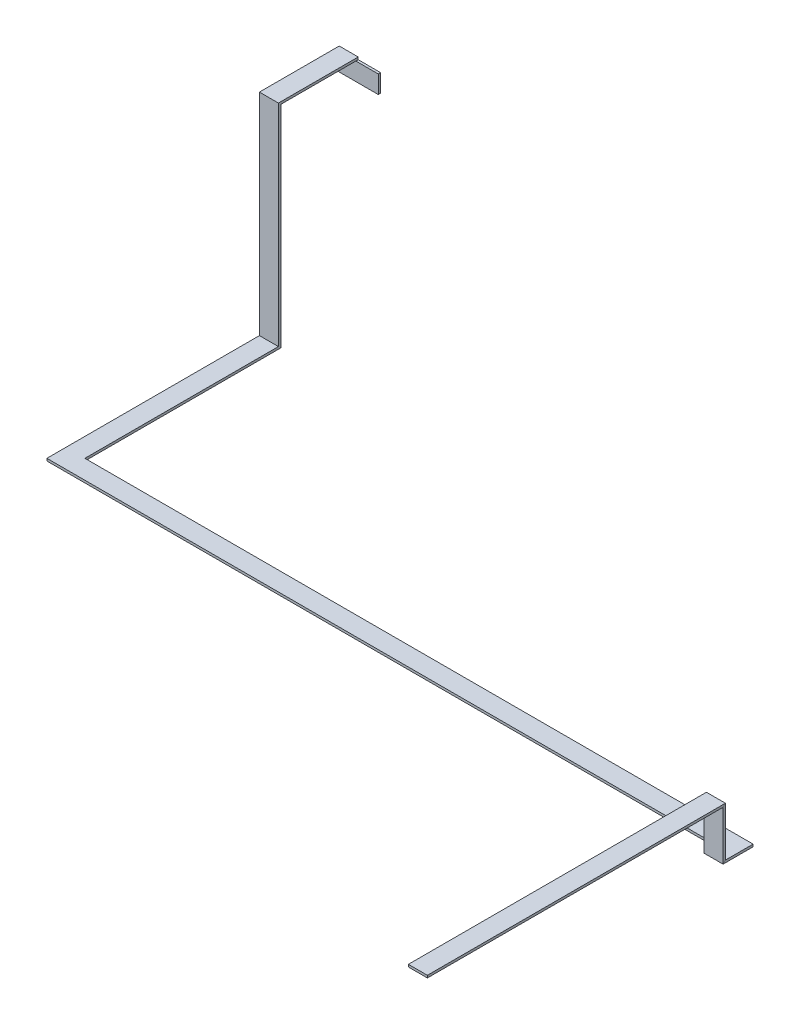
ISO-10303-21;
HEADER;
FILE_DESCRIPTION(('STEP AP214'),'2;1');
FILE_NAME('part.step','',(''),(''),'','','');
FILE_SCHEMA(('AUTOMOTIVE_DESIGN { 1 0 10303 214 1 1 1 1 }'));
ENDSEC;
DATA;
#1=APPLICATION_CONTEXT('core data for automotive mechanical design processes');
#2=APPLICATION_PROTOCOL_DEFINITION('international standard','automotive_design',2000,#1);
#3=PRODUCT_CONTEXT('',#1,'mechanical');
#4=PRODUCT('Part','Part','',(#3));
#5=PRODUCT_RELATED_PRODUCT_CATEGORY('part','',(#4));
#6=PRODUCT_DEFINITION_FORMATION('','',#4);
#7=PRODUCT_DEFINITION_CONTEXT('part definition',#1,'design');
#8=PRODUCT_DEFINITION('design','',#6,#7);
#9=PRODUCT_DEFINITION_SHAPE('','',#8);
#10=(LENGTH_UNIT() NAMED_UNIT(*) SI_UNIT(.MILLI.,.METRE.));
#11=(NAMED_UNIT(*) PLANE_ANGLE_UNIT() SI_UNIT($,.RADIAN.));
#12=(NAMED_UNIT(*) SI_UNIT($,.STERADIAN.) SOLID_ANGLE_UNIT());
#13=UNCERTAINTY_MEASURE_WITH_UNIT(LENGTH_MEASURE(1.E-05),#10,'distance_accuracy_value','');
#14=(GEOMETRIC_REPRESENTATION_CONTEXT(3) GLOBAL_UNCERTAINTY_ASSIGNED_CONTEXT((#13)) GLOBAL_UNIT_ASSIGNED_CONTEXT((#10,
#11,#12)) REPRESENTATION_CONTEXT('',''));
#15=CARTESIAN_POINT('',(0.,0.,0.));
#16=DIRECTION('',(0.,0.,1.));
#17=DIRECTION('',(1.,0.,0.));
#18=AXIS2_PLACEMENT_3D('',#15,#16,#17);
#19=CARTESIAN_POINT('',(0.,0.,0.));
#20=DIRECTION('',(0.,0.,1.));
#21=DIRECTION('',(1.,0.,0.));
#22=AXIS2_PLACEMENT_3D('',#19,#20,#21);
#23=PLANE('',#22);
#24=DIRECTION('',(-1.,0.,0.));
#25=VECTOR('',#24,1.);
#26=CARTESIAN_POINT('',(25.4,278.885,0.));
#27=LINE('',#26,#25);
#28=CARTESIAN_POINT('',(25.4,278.885,0.));
#29=VERTEX_POINT('',#28);
#30=CARTESIAN_POINT('',(-25.4,278.885,0.));
#31=VERTEX_POINT('',#30);
#32=EDGE_CURVE('E273',#29,#31,#27,.T.);
#33=ORIENTED_EDGE('',*,*,#32,.F.);
#34=DIRECTION('',(0.,1.,0.));
#35=VECTOR('',#34,1.);
#36=CARTESIAN_POINT('',(25.4,285.195,0.));
#37=LINE('',#36,#35);
#38=CARTESIAN_POINT('',(25.4,-285.195,0.));
#39=VERTEX_POINT('',#38);
#40=EDGE_CURVE('E316',#39,#29,#37,.T.);
#41=ORIENTED_EDGE('',*,*,#40,.F.);
#42=DIRECTION('',(1.,0.,0.));
#43=VECTOR('',#42,1.);
#44=CARTESIAN_POINT('',(-25.4,-285.195,0.));
#45=LINE('',#44,#43);
#46=CARTESIAN_POINT('',(-25.4,-285.195,0.));
#47=VERTEX_POINT('',#46);
#48=EDGE_CURVE('E320',#47,#39,#45,.T.);
#49=ORIENTED_EDGE('',*,*,#48,.F.);
#50=DIRECTION('',(0.,-1.,0.));
#51=VECTOR('',#50,1.);
#52=CARTESIAN_POINT('',(-25.4,285.195,0.));
#53=LINE('',#52,#51);
#54=EDGE_CURVE('E327',#31,#47,#53,.T.);
#55=ORIENTED_EDGE('',*,*,#54,.F.);
#56=EDGE_LOOP('',(#33,#41,#49,#55));
#57=FACE_BOUND('',#56,.T.);
#58=ADVANCED_FACE('F37',(#57),#23,.F.);
#59=CARTESIAN_POINT('',(25.4,285.195,6.31));
#60=DIRECTION('',(-1.,0.,0.));
#61=DIRECTION('',(0.,-1.,0.));
#62=AXIS2_PLACEMENT_3D('',#59,#60,#61);
#63=PLANE('',#62);
#64=DIRECTION('',(0.,0.,-1.));
#65=VECTOR('',#64,1.);
#66=CARTESIAN_POINT('',(25.4,278.885,0.));
#67=LINE('',#66,#65);
#68=CARTESIAN_POINT('',(25.4,278.885,-200.845));
#69=VERTEX_POINT('',#68);
#70=EDGE_CURVE('E272',#29,#69,#67,.T.);
#71=ORIENTED_EDGE('',*,*,#70,.T.);
#72=DIRECTION('',(0.,0.,1.));
#73=VECTOR('',#72,1.);
#74=CARTESIAN_POINT('',(25.4,278.885,-207.155));
#75=LINE('',#74,#73);
#76=CARTESIAN_POINT('',(25.4,278.885,-207.155));
#77=VERTEX_POINT('',#76);
#78=EDGE_CURVE('E251',#77,#69,#75,.T.);
#79=ORIENTED_EDGE('',*,*,#78,.F.);
#80=DIRECTION('',(0.,-1.,0.));
#81=VECTOR('',#80,1.);
#82=CARTESIAN_POINT('',(25.4,278.885,-207.155));
#83=LINE('',#82,#81);
#84=CARTESIAN_POINT('',(25.4,285.195,-207.155));
#85=VERTEX_POINT('',#84);
#86=EDGE_CURVE('E246',#85,#77,#83,.T.);
#87=ORIENTED_EDGE('',*,*,#86,.F.);
#88=DIRECTION('',(0.,0.,-1.));
#89=VECTOR('',#88,1.);
#90=CARTESIAN_POINT('',(25.4,285.195,6.31));
#91=LINE('',#90,#89);
#92=CARTESIAN_POINT('',(25.4,285.195,6.31));
#93=VERTEX_POINT('',#92);
#94=EDGE_CURVE('E11',#93,#85,#91,.T.);
#95=ORIENTED_EDGE('',*,*,#94,.F.);
#96=DIRECTION('',(0.,1.,0.));
#97=VECTOR('',#96,1.);
#98=CARTESIAN_POINT('',(25.4,285.195,6.31));
#99=LINE('',#98,#97);
#100=CARTESIAN_POINT('',(25.4,-278.885,6.31));
#101=VERTEX_POINT('',#100);
#102=EDGE_CURVE('E317',#101,#93,#99,.T.);
#103=ORIENTED_EDGE('',*,*,#102,.F.);
#104=DIRECTION('',(0.,0.,-1.));
#105=VECTOR('',#104,1.);
#106=CARTESIAN_POINT('',(25.4,-278.885,574.75));
#107=LINE('',#106,#105);
#108=CARTESIAN_POINT('',(25.4,-278.885,523.95));
#109=VERTEX_POINT('',#108);
#110=EDGE_CURVE('E314',#109,#101,#107,.T.);
#111=ORIENTED_EDGE('',*,*,#110,.F.);
#112=DIRECTION('',(0.,1.,0.));
#113=VECTOR('',#112,1.);
#114=CARTESIAN_POINT('',(25.4,-285.195,523.95));
#115=LINE('',#114,#113);
#116=CARTESIAN_POINT('',(25.4,-285.195,523.95));
#117=VERTEX_POINT('',#116);
#118=EDGE_CURVE('E264',#117,#109,#115,.T.);
#119=ORIENTED_EDGE('',*,*,#118,.F.);
#120=DIRECTION('',(0.,0.,-1.));
#121=VECTOR('',#120,1.);
#122=CARTESIAN_POINT('',(25.4,-285.195,6.31));
#123=LINE('',#122,#121);
#124=EDGE_CURVE('E324',#117,#39,#123,.T.);
#125=ORIENTED_EDGE('',*,*,#124,.T.);
#126=ORIENTED_EDGE('',*,*,#40,.T.);
#127=EDGE_LOOP('',(#71,#79,#87,#95,#103,#111,#119,#125,#126));
#128=FACE_BOUND('',#127,.T.);
#129=ADVANCED_FACE('F39',(#128),#63,.F.);
#130=CARTESIAN_POINT('',(-25.4,285.195,6.31));
#131=DIRECTION('',(0.,-1.,0.));
#132=DIRECTION('',(0.,0.,-1.));
#133=AXIS2_PLACEMENT_3D('',#130,#131,#132);
#134=PLANE('',#133);
#135=ORIENTED_EDGE('',*,*,#94,.T.);
#136=DIRECTION('',(-1.,0.,0.));
#137=VECTOR('',#136,1.);
#138=CARTESIAN_POINT('',(25.4,285.195,-207.155));
#139=LINE('',#138,#137);
#140=CARTESIAN_POINT('',(-25.4,285.195,-207.155));
#141=VERTEX_POINT('',#140);
#142=EDGE_CURVE('E262',#85,#141,#139,.T.);
#143=ORIENTED_EDGE('',*,*,#142,.T.);
#144=DIRECTION('',(0.,0.,-1.));
#145=VECTOR('',#144,1.);
#146=CARTESIAN_POINT('',(-25.4,285.195,6.31));
#147=LINE('',#146,#145);
#148=CARTESIAN_POINT('',(-25.4,285.195,6.31));
#149=VERTEX_POINT('',#148);
#150=EDGE_CURVE('E45',#149,#141,#147,.T.);
#151=ORIENTED_EDGE('',*,*,#150,.F.);
#152=DIRECTION('',(-1.,0.,0.));
#153=VECTOR('',#152,1.);
#154=CARTESIAN_POINT('',(-25.4,285.195,6.31));
#155=LINE('',#154,#153);
#156=EDGE_CURVE('E319',#93,#149,#155,.T.);
#157=ORIENTED_EDGE('',*,*,#156,.F.);
#158=EDGE_LOOP('',(#135,#143,#151,#157));
#159=FACE_BOUND('',#158,.T.);
#160=ADVANCED_FACE('F412',(#159),#134,.F.);
#161=CARTESIAN_POINT('',(-25.4,285.195,6.31));
#162=DIRECTION('',(1.,0.,0.));
#163=DIRECTION('',(0.,1.,0.));
#164=AXIS2_PLACEMENT_3D('',#161,#162,#163);
#165=PLANE('',#164);
#166=ORIENTED_EDGE('',*,*,#150,.T.);
#167=DIRECTION('',(0.,-0.707106781186548,0.707106781186548));
#168=VECTOR('',#167,1.);
#169=CARTESIAN_POINT('',(-25.4,178.4625,-100.4225));
#170=LINE('',#169,#168);
#171=CARTESIAN_POINT('',(-25.4,278.885,-200.845));
#172=VERTEX_POINT('',#171);
#173=EDGE_CURVE('E268',#141,#172,#170,.T.);
#174=ORIENTED_EDGE('',*,*,#173,.T.);
#175=DIRECTION('',(0.,0.,-1.));
#176=VECTOR('',#175,1.);
#177=CARTESIAN_POINT('',(-25.4,278.885,0.));
#178=LINE('',#177,#176);
#179=EDGE_CURVE('E269',#31,#172,#178,.T.);
#180=ORIENTED_EDGE('',*,*,#179,.F.);
#181=ORIENTED_EDGE('',*,*,#54,.T.);
#182=DIRECTION('',(0.,0.,-1.));
#183=VECTOR('',#182,1.);
#184=CARTESIAN_POINT('',(-25.4,-285.195,6.31));
#185=LINE('',#184,#183);
#186=CARTESIAN_POINT('',(-25.4,-285.195,574.75));
#187=VERTEX_POINT('',#186);
#188=EDGE_CURVE('E331',#187,#47,#185,.T.);
#189=ORIENTED_EDGE('',*,*,#188,.F.);
#190=DIRECTION('',(0.,-1.,0.));
#191=VECTOR('',#190,1.);
#192=CARTESIAN_POINT('',(-25.4,-278.885,574.75));
#193=LINE('',#192,#191);
#194=CARTESIAN_POINT('',(-25.4,-278.885,574.75));
#195=VERTEX_POINT('',#194);
#196=EDGE_CURVE('E172',#195,#187,#193,.T.);
#197=ORIENTED_EDGE('',*,*,#196,.F.);
#198=DIRECTION('',(0.,0.,-1.));
#199=VECTOR('',#198,1.);
#200=CARTESIAN_POINT('',(-25.4,-278.885,574.75));
#201=LINE('',#200,#199);
#202=CARTESIAN_POINT('',(-25.4,-278.885,6.31));
#203=VERTEX_POINT('',#202);
#204=EDGE_CURVE('E176',#195,#203,#201,.T.);
#205=ORIENTED_EDGE('',*,*,#204,.T.);
#206=DIRECTION('',(0.,-1.,0.));
#207=VECTOR('',#206,1.);
#208=CARTESIAN_POINT('',(-25.4,285.195,6.31));
#209=LINE('',#208,#207);
#210=EDGE_CURVE('E322',#149,#203,#209,.T.);
#211=ORIENTED_EDGE('',*,*,#210,.F.);
#212=EDGE_LOOP('',(#166,#174,#180,#181,#189,#197,#205,#211));
#213=FACE_BOUND('',#212,.T.);
#214=ADVANCED_FACE('F337',(#213),#165,.F.);
#215=CARTESIAN_POINT('',(-25.4,-285.195,6.31));
#216=DIRECTION('',(0.,1.,0.));
#217=DIRECTION('',(0.,0.,1.));
#218=AXIS2_PLACEMENT_3D('',#215,#216,#217);
#219=PLANE('',#218);
#220=ORIENTED_EDGE('',*,*,#48,.T.);
#221=ORIENTED_EDGE('',*,*,#124,.F.);
#222=DIRECTION('',(-1.,0.,0.));
#223=VECTOR('',#222,1.);
#224=CARTESIAN_POINT('',(1812.7,-285.195,523.95));
#225=LINE('',#224,#223);
#226=CARTESIAN_POINT('',(1812.7,-285.195,523.95));
#227=VERTEX_POINT('',#226);
#228=EDGE_CURVE('E303',#227,#117,#225,.T.);
#229=ORIENTED_EDGE('',*,*,#228,.F.);
#230=DIRECTION('',(0.,0.,-1.));
#231=VECTOR('',#230,1.);
#232=CARTESIAN_POINT('',(1812.7,-285.195,523.95));
#233=LINE('',#232,#231);
#234=CARTESIAN_POINT('',(1812.7,-285.195,604.315));
#235=VERTEX_POINT('',#234);
#236=EDGE_CURVE('E292',#235,#227,#233,.T.);
#237=ORIENTED_EDGE('',*,*,#236,.F.);
#238=DIRECTION('',(-1.,0.,0.));
#239=VECTOR('',#238,1.);
#240=CARTESIAN_POINT('',(1761.9,-285.195,604.315));
#241=LINE('',#240,#239);
#242=CARTESIAN_POINT('',(1761.9,-285.195,604.315));
#243=VERTEX_POINT('',#242);
#244=EDGE_CURVE('E192',#235,#243,#241,.T.);
#245=ORIENTED_EDGE('',*,*,#244,.T.);
#246=DIRECTION('',(0.,0.,1.));
#247=VECTOR('',#246,1.);
#248=CARTESIAN_POINT('',(1761.9,-285.195,574.75));
#249=LINE('',#248,#247);
#250=CARTESIAN_POINT('',(1761.9,-285.195,574.75));
#251=VERTEX_POINT('',#250);
#252=EDGE_CURVE('E183',#251,#243,#249,.T.);
#253=ORIENTED_EDGE('',*,*,#252,.F.);
#254=DIRECTION('',(1.,0.,0.));
#255=VECTOR('',#254,1.);
#256=CARTESIAN_POINT('',(-25.4,-285.195,574.75));
#257=LINE('',#256,#255);
#258=EDGE_CURVE('E169',#187,#251,#257,.T.);
#259=ORIENTED_EDGE('',*,*,#258,.F.);
#260=ORIENTED_EDGE('',*,*,#188,.T.);
#261=EDGE_LOOP('',(#220,#221,#229,#237,#245,#253,#259,#260));
#262=FACE_BOUND('',#261,.T.);
#263=ADVANCED_FACE('F190',(#262),#219,.F.);
#264=CARTESIAN_POINT('',(0.,0.,6.31));
#265=DIRECTION('',(0.,0.,1.));
#266=DIRECTION('',(1.,0.,0.));
#267=AXIS2_PLACEMENT_3D('',#264,#265,#266);
#268=PLANE('',#267);
#269=DIRECTION('',(-1.,0.,0.));
#270=VECTOR('',#269,1.);
#271=CARTESIAN_POINT('',(-25.4,-278.885,6.31));
#272=LINE('',#271,#270);
#273=EDGE_CURVE('E306',#101,#203,#272,.T.);
#274=ORIENTED_EDGE('',*,*,#273,.F.);
#275=ORIENTED_EDGE('',*,*,#102,.T.);
#276=ORIENTED_EDGE('',*,*,#156,.T.);
#277=ORIENTED_EDGE('',*,*,#210,.T.);
#278=EDGE_LOOP('',(#274,#275,#276,#277));
#279=FACE_BOUND('',#278,.T.);
#280=ADVANCED_FACE('F410',(#279),#268,.T.);
#281=CARTESIAN_POINT('',(-25.4,-278.885,574.75));
#282=DIRECTION('',(0.,-1.,0.));
#283=DIRECTION('',(0.,0.,-1.));
#284=AXIS2_PLACEMENT_3D('',#281,#282,#283);
#285=PLANE('',#284);
#286=ORIENTED_EDGE('',*,*,#273,.T.);
#287=ORIENTED_EDGE('',*,*,#204,.F.);
#288=DIRECTION('',(-1.,0.,0.));
#289=VECTOR('',#288,1.);
#290=CARTESIAN_POINT('',(-25.4,-278.885,574.75));
#291=LINE('',#290,#289);
#292=CARTESIAN_POINT('',(1761.9,-278.885,574.75));
#293=VERTEX_POINT('',#292);
#294=EDGE_CURVE('E307',#293,#195,#291,.T.);
#295=ORIENTED_EDGE('',*,*,#294,.F.);
#296=DIRECTION('',(0.,0.,1.));
#297=VECTOR('',#296,1.);
#298=CARTESIAN_POINT('',(1761.9,-278.885,574.75));
#299=LINE('',#298,#297);
#300=CARTESIAN_POINT('',(1761.9,-278.885,598.005));
#301=VERTEX_POINT('',#300);
#302=EDGE_CURVE('E185',#293,#301,#299,.T.);
#303=ORIENTED_EDGE('',*,*,#302,.T.);
#304=DIRECTION('',(1.,0.,0.));
#305=VECTOR('',#304,1.);
#306=CARTESIAN_POINT('',(1761.9,-278.885,598.005));
#307=LINE('',#306,#305);
#308=CARTESIAN_POINT('',(1812.7,-278.885,598.005));
#309=VERTEX_POINT('',#308);
#310=EDGE_CURVE('E195',#301,#309,#307,.T.);
#311=ORIENTED_EDGE('',*,*,#310,.T.);
#312=DIRECTION('',(0.,0.,1.));
#313=VECTOR('',#312,1.);
#314=CARTESIAN_POINT('',(1812.7,-278.885,523.95));
#315=LINE('',#314,#313);
#316=CARTESIAN_POINT('',(1812.7,-278.885,523.95));
#317=VERTEX_POINT('',#316);
#318=EDGE_CURVE('E296',#317,#309,#315,.T.);
#319=ORIENTED_EDGE('',*,*,#318,.F.);
#320=DIRECTION('',(-1.,0.,0.));
#321=VECTOR('',#320,1.);
#322=CARTESIAN_POINT('',(1812.7,-278.885,523.95));
#323=LINE('',#322,#321);
#324=EDGE_CURVE('E298',#317,#109,#323,.T.);
#325=ORIENTED_EDGE('',*,*,#324,.T.);
#326=ORIENTED_EDGE('',*,*,#110,.T.);
#327=EDGE_LOOP('',(#286,#287,#295,#303,#311,#319,#325,#326));
#328=FACE_BOUND('',#327,.T.);
#329=ADVANCED_FACE('F405',(#328),#285,.F.);
#330=CARTESIAN_POINT('',(0.,0.,574.75));
#331=DIRECTION('',(0.,0.,1.));
#332=DIRECTION('',(1.,0.,0.));
#333=AXIS2_PLACEMENT_3D('',#330,#331,#332);
#334=PLANE('',#333);
#335=DIRECTION('',(0.,-1.,0.));
#336=VECTOR('',#335,1.);
#337=CARTESIAN_POINT('',(1761.9,-278.885,574.75));
#338=LINE('',#337,#336);
#339=EDGE_CURVE('E52',#293,#251,#338,.T.);
#340=ORIENTED_EDGE('',*,*,#339,.F.);
#341=ORIENTED_EDGE('',*,*,#294,.T.);
#342=ORIENTED_EDGE('',*,*,#196,.T.);
#343=ORIENTED_EDGE('',*,*,#258,.T.);
#344=EDGE_LOOP('',(#340,#341,#342,#343));
#345=FACE_BOUND('',#344,.T.);
#346=ADVANCED_FACE('F170',(#345),#334,.T.);
#347=CARTESIAN_POINT('',(1812.7,-285.195,523.95));
#348=DIRECTION('',(0.,0.,1.));
#349=DIRECTION('',(1.,0.,0.));
#350=AXIS2_PLACEMENT_3D('',#347,#348,#349);
#351=PLANE('',#350);
#352=ORIENTED_EDGE('',*,*,#118,.T.);
#353=ORIENTED_EDGE('',*,*,#324,.F.);
#354=DIRECTION('',(0.,1.,0.));
#355=VECTOR('',#354,1.);
#356=CARTESIAN_POINT('',(1812.7,-285.195,523.95));
#357=LINE('',#356,#355);
#358=EDGE_CURVE('E294',#227,#317,#357,.T.);
#359=ORIENTED_EDGE('',*,*,#358,.F.);
#360=ORIENTED_EDGE('',*,*,#228,.T.);
#361=EDGE_LOOP('',(#352,#353,#359,#360));
#362=FACE_BOUND('',#361,.T.);
#363=ADVANCED_FACE('F373',(#362),#351,.F.);
#364=CARTESIAN_POINT('',(1812.7,1.97302717093577E-13,0.));
#365=DIRECTION('',(1.,0.,0.));
#366=DIRECTION('',(0.,0.,-1.));
#367=AXIS2_PLACEMENT_3D('',#364,#365,#366);
#368=PLANE('',#367);
#369=ORIENTED_EDGE('',*,*,#318,.T.);
#370=DIRECTION('',(0.,-0.707106781186548,0.707106781186548));
#371=VECTOR('',#370,1.);
#372=CARTESIAN_POINT('',(1812.7,-267.2575,586.3775));
#373=LINE('',#372,#371);
#374=EDGE_CURVE('E380',#309,#235,#373,.T.);
#375=ORIENTED_EDGE('',*,*,#374,.T.);
#376=ORIENTED_EDGE('',*,*,#236,.T.);
#377=ORIENTED_EDGE('',*,*,#358,.T.);
#378=EDGE_LOOP('',(#369,#375,#376,#377));
#379=FACE_BOUND('',#378,.T.);
#380=ADVANCED_FACE('F377',(#379),#368,.T.);
#381=CARTESIAN_POINT('',(0.,231.24,78.0400000000001));
#382=DIRECTION('',(0.,1.,0.));
#383=DIRECTION('',(1.,0.,0.));
#384=AXIS2_PLACEMENT_3D('',#381,#382,#383);
#385=PLANE('',#384);
#386=DIRECTION('',(0.,0.,-1.));
#387=VECTOR('',#386,1.);
#388=CARTESIAN_POINT('',(-25.4,231.24,-200.845));
#389=LINE('',#388,#387);
#390=CARTESIAN_POINT('',(-25.4,231.24,-200.845));
#391=VERTEX_POINT('',#390);
#392=CARTESIAN_POINT('',(-25.4,231.24,-207.155));
#393=VERTEX_POINT('',#392);
#394=EDGE_CURVE('E285',#391,#393,#389,.T.);
#395=ORIENTED_EDGE('',*,*,#394,.T.);
#396=DIRECTION('',(1.,0.,0.));
#397=VECTOR('',#396,1.);
#398=CARTESIAN_POINT('',(25.4,231.24,-207.155));
#399=LINE('',#398,#397);
#400=CARTESIAN_POINT('',(85.4,231.24,-207.155));
#401=VERTEX_POINT('',#400);
#402=EDGE_CURVE('E282',#393,#401,#399,.T.);
#403=ORIENTED_EDGE('',*,*,#402,.T.);
#404=DIRECTION('',(0.,0.,-1.));
#405=VECTOR('',#404,1.);
#406=CARTESIAN_POINT('',(85.4,231.24,-200.845));
#407=LINE('',#406,#405);
#408=CARTESIAN_POINT('',(85.4,231.24,-200.845));
#409=VERTEX_POINT('',#408);
#410=EDGE_CURVE('E257',#409,#401,#407,.T.);
#411=ORIENTED_EDGE('',*,*,#410,.F.);
#412=DIRECTION('',(-1.,0.,0.));
#413=VECTOR('',#412,1.);
#414=CARTESIAN_POINT('',(25.4,231.24,-200.845));
#415=LINE('',#414,#413);
#416=EDGE_CURVE('E261',#409,#391,#415,.T.);
#417=ORIENTED_EDGE('',*,*,#416,.T.);
#418=EDGE_LOOP('',(#395,#403,#411,#417));
#419=FACE_BOUND('',#418,.T.);
#420=ADVANCED_FACE('F353',(#419),#385,.F.);
#421=CARTESIAN_POINT('',(-25.4,285.6105,-200.845));
#422=DIRECTION('',(-1.,0.,0.));
#423=DIRECTION('',(0.,0.,1.));
#424=AXIS2_PLACEMENT_3D('',#421,#422,#423);
#425=PLANE('',#424);
#426=ORIENTED_EDGE('',*,*,#173,.F.);
#427=DIRECTION('',(0.,-1.,0.));
#428=VECTOR('',#427,1.);
#429=CARTESIAN_POINT('',(-25.4,285.6105,-207.155));
#430=LINE('',#429,#428);
#431=EDGE_CURVE('E287',#141,#393,#430,.T.);
#432=ORIENTED_EDGE('',*,*,#431,.T.);
#433=ORIENTED_EDGE('',*,*,#394,.F.);
#434=DIRECTION('',(0.,-1.,0.));
#435=VECTOR('',#434,1.);
#436=CARTESIAN_POINT('',(-25.4,285.6105,-200.845));
#437=LINE('',#436,#435);
#438=EDGE_CURVE('E278',#172,#391,#437,.T.);
#439=ORIENTED_EDGE('',*,*,#438,.F.);
#440=EDGE_LOOP('',(#426,#432,#433,#439));
#441=FACE_BOUND('',#440,.T.);
#442=ADVANCED_FACE('F344',(#441),#425,.T.);
#443=CARTESIAN_POINT('',(25.4,285.6105,-207.155));
#444=DIRECTION('',(0.,0.,-1.));
#445=DIRECTION('',(-1.,0.,0.));
#446=AXIS2_PLACEMENT_3D('',#443,#444,#445);
#447=PLANE('',#446);
#448=DIRECTION('',(1.,0.,0.));
#449=VECTOR('',#448,1.);
#450=CARTESIAN_POINT('',(85.4,278.885,-207.155));
#451=LINE('',#450,#449);
#452=CARTESIAN_POINT('',(85.4,278.885,-207.155));
#453=VERTEX_POINT('',#452);
#454=EDGE_CURVE('E243',#77,#453,#451,.T.);
#455=ORIENTED_EDGE('',*,*,#454,.T.);
#456=DIRECTION('',(0.,-1.,0.));
#457=VECTOR('',#456,1.);
#458=CARTESIAN_POINT('',(85.4,231.24,-207.155));
#459=LINE('',#458,#457);
#460=EDGE_CURVE('E253',#453,#401,#459,.T.);
#461=ORIENTED_EDGE('',*,*,#460,.T.);
#462=ORIENTED_EDGE('',*,*,#402,.F.);
#463=ORIENTED_EDGE('',*,*,#431,.F.);
#464=ORIENTED_EDGE('',*,*,#142,.F.);
#465=ORIENTED_EDGE('',*,*,#86,.T.);
#466=EDGE_LOOP('',(#455,#461,#462,#463,#464,#465));
#467=FACE_BOUND('',#466,.T.);
#468=ADVANCED_FACE('F349',(#467),#447,.T.);
#469=CARTESIAN_POINT('',(25.4,285.6105,-200.845));
#470=DIRECTION('',(0.,0.,1.));
#471=DIRECTION('',(1.,0.,0.));
#472=AXIS2_PLACEMENT_3D('',#469,#470,#471);
#473=PLANE('',#472);
#474=DIRECTION('',(1.,0.,0.));
#475=VECTOR('',#474,1.);
#476=CARTESIAN_POINT('',(85.4,278.885,-200.845));
#477=LINE('',#476,#475);
#478=CARTESIAN_POINT('',(85.4,278.885,-200.845));
#479=VERTEX_POINT('',#478);
#480=EDGE_CURVE('E60',#69,#479,#477,.T.);
#481=ORIENTED_EDGE('',*,*,#480,.F.);
#482=DIRECTION('',(1.,0.,0.));
#483=VECTOR('',#482,1.);
#484=CARTESIAN_POINT('',(25.4,278.885,-200.845));
#485=LINE('',#484,#483);
#486=EDGE_CURVE('E265',#172,#69,#485,.T.);
#487=ORIENTED_EDGE('',*,*,#486,.F.);
#488=ORIENTED_EDGE('',*,*,#438,.T.);
#489=ORIENTED_EDGE('',*,*,#416,.F.);
#490=DIRECTION('',(0.,-1.,0.));
#491=VECTOR('',#490,1.);
#492=CARTESIAN_POINT('',(85.4,231.24,-200.845));
#493=LINE('',#492,#491);
#494=EDGE_CURVE('E255',#479,#409,#493,.T.);
#495=ORIENTED_EDGE('',*,*,#494,.F.);
#496=EDGE_LOOP('',(#481,#487,#488,#489,#495));
#497=FACE_BOUND('',#496,.T.);
#498=ADVANCED_FACE('F359',(#497),#473,.T.);
#499=CARTESIAN_POINT('',(25.4,278.885,0.));
#500=DIRECTION('',(0.,-1.,0.));
#501=DIRECTION('',(0.,0.,-1.));
#502=AXIS2_PLACEMENT_3D('',#499,#500,#501);
#503=PLANE('',#502);
#504=ORIENTED_EDGE('',*,*,#179,.T.);
#505=ORIENTED_EDGE('',*,*,#486,.T.);
#506=ORIENTED_EDGE('',*,*,#70,.F.);
#507=ORIENTED_EDGE('',*,*,#32,.T.);
#508=EDGE_LOOP('',(#504,#505,#506,#507));
#509=FACE_BOUND('',#508,.T.);
#510=ADVANCED_FACE('F362',(#509),#503,.T.);
#511=CARTESIAN_POINT('',(85.4,231.24,-200.845));
#512=DIRECTION('',(1.,0.,0.));
#513=DIRECTION('',(0.,0.,-1.));
#514=AXIS2_PLACEMENT_3D('',#511,#512,#513);
#515=PLANE('',#514);
#516=DIRECTION('',(0.,0.,1.));
#517=VECTOR('',#516,1.);
#518=CARTESIAN_POINT('',(85.4,278.885,-207.155));
#519=LINE('',#518,#517);
#520=EDGE_CURVE('E249',#453,#479,#519,.T.);
#521=ORIENTED_EDGE('',*,*,#520,.T.);
#522=ORIENTED_EDGE('',*,*,#494,.T.);
#523=ORIENTED_EDGE('',*,*,#410,.T.);
#524=ORIENTED_EDGE('',*,*,#460,.F.);
#525=EDGE_LOOP('',(#521,#522,#523,#524));
#526=FACE_BOUND('',#525,.T.);
#527=ADVANCED_FACE('F355',(#526),#515,.T.);
#528=CARTESIAN_POINT('',(85.4,278.885,-207.155));
#529=DIRECTION('',(0.,-1.,0.));
#530=DIRECTION('',(0.,0.,-1.));
#531=AXIS2_PLACEMENT_3D('',#528,#529,#530);
#532=PLANE('',#531);
#533=ORIENTED_EDGE('',*,*,#480,.T.);
#534=ORIENTED_EDGE('',*,*,#520,.F.);
#535=ORIENTED_EDGE('',*,*,#454,.F.);
#536=ORIENTED_EDGE('',*,*,#78,.T.);
#537=EDGE_LOOP('',(#533,#534,#535,#536));
#538=FACE_BOUND('',#537,.T.);
#539=ADVANCED_FACE('F454',(#538),#532,.F.);
#540=CARTESIAN_POINT('',(0.,131.76,1395.16));
#541=DIRECTION('',(0.,0.,1.));
#542=DIRECTION('',(1.,0.,0.));
#543=AXIS2_PLACEMENT_3D('',#540,#541,#542);
#544=PLANE('',#543);
#545=DIRECTION('',(0.,1.,0.));
#546=VECTOR('',#545,1.);
#547=CARTESIAN_POINT('',(1812.7,-147.125,1395.16));
#548=LINE('',#547,#546);
#549=CARTESIAN_POINT('',(1812.7,-153.435,1395.16));
#550=VERTEX_POINT('',#549);
#551=CARTESIAN_POINT('',(1812.7,-147.125,1395.16));
#552=VERTEX_POINT('',#551);
#553=EDGE_CURVE('E226',#550,#552,#548,.T.);
#554=ORIENTED_EDGE('',*,*,#553,.T.);
#555=DIRECTION('',(-1.,0.,0.));
#556=VECTOR('',#555,1.);
#557=CARTESIAN_POINT('',(1761.9,-147.125,1395.16));
#558=LINE('',#557,#556);
#559=CARTESIAN_POINT('',(1761.9,-147.125,1395.16));
#560=VERTEX_POINT('',#559);
#561=EDGE_CURVE('E224',#552,#560,#558,.T.);
#562=ORIENTED_EDGE('',*,*,#561,.T.);
#563=DIRECTION('',(0.,-1.,0.));
#564=VECTOR('',#563,1.);
#565=CARTESIAN_POINT('',(1761.9,-147.125,1395.16));
#566=LINE('',#565,#564);
#567=CARTESIAN_POINT('',(1761.9,-153.435,1395.16));
#568=VERTEX_POINT('',#567);
#569=EDGE_CURVE('E230',#560,#568,#566,.T.);
#570=ORIENTED_EDGE('',*,*,#569,.T.);
#571=DIRECTION('',(1.,0.,0.));
#572=VECTOR('',#571,1.);
#573=CARTESIAN_POINT('',(1761.9,-153.435,1395.16));
#574=LINE('',#573,#572);
#575=EDGE_CURVE('E228',#568,#550,#574,.T.);
#576=ORIENTED_EDGE('',*,*,#575,.T.);
#577=EDGE_LOOP('',(#554,#562,#570,#576));
#578=FACE_BOUND('',#577,.T.);
#579=ADVANCED_FACE('F457',(#578),#544,.T.);
#580=CARTESIAN_POINT('',(1761.9,-147.125,597.5895));
#581=DIRECTION('',(-1.,0.,0.));
#582=DIRECTION('',(0.,0.,1.));
#583=AXIS2_PLACEMENT_3D('',#580,#581,#582);
#584=PLANE('',#583);
#585=DIRECTION('',(0.,0.707106781186548,-0.707106781186548));
#586=VECTOR('',#585,1.);
#587=CARTESIAN_POINT('',(1761.9,-216.36775,667.24775));
#588=LINE('',#587,#586);
#589=CARTESIAN_POINT('',(1761.9,-153.435,604.315));
#590=VERTEX_POINT('',#589);
#591=CARTESIAN_POINT('',(1761.9,-147.125,598.005));
#592=VERTEX_POINT('',#591);
#593=EDGE_CURVE('E208',#590,#592,#588,.T.);
#594=ORIENTED_EDGE('',*,*,#593,.F.);
#595=DIRECTION('',(0.,0.,1.));
#596=VECTOR('',#595,1.);
#597=CARTESIAN_POINT('',(1761.9,-153.435,597.5895));
#598=LINE('',#597,#596);
#599=EDGE_CURVE('E238',#590,#568,#598,.T.);
#600=ORIENTED_EDGE('',*,*,#599,.T.);
#601=ORIENTED_EDGE('',*,*,#569,.F.);
#602=DIRECTION('',(0.,0.,1.));
#603=VECTOR('',#602,1.);
#604=CARTESIAN_POINT('',(1761.9,-147.125,597.5895));
#605=LINE('',#604,#603);
#606=EDGE_CURVE('E213',#592,#560,#605,.T.);
#607=ORIENTED_EDGE('',*,*,#606,.F.);
#608=EDGE_LOOP('',(#594,#600,#601,#607));
#609=FACE_BOUND('',#608,.T.);
#610=ADVANCED_FACE('F460',(#609),#584,.T.);
#611=CARTESIAN_POINT('',(1761.9,-153.435,597.5895));
#612=DIRECTION('',(0.,-1.,0.));
#613=DIRECTION('',(0.,0.,-1.));
#614=AXIS2_PLACEMENT_3D('',#611,#612,#613);
#615=PLANE('',#614);
#616=DIRECTION('',(-1.,0.,0.));
#617=VECTOR('',#616,1.);
#618=CARTESIAN_POINT('',(1761.9,-153.435,604.315));
#619=LINE('',#618,#617);
#620=CARTESIAN_POINT('',(1812.7,-153.435,604.315));
#621=VERTEX_POINT('',#620);
#622=EDGE_CURVE('E186',#621,#590,#619,.T.);
#623=ORIENTED_EDGE('',*,*,#622,.F.);
#624=DIRECTION('',(0.,0.,1.));
#625=VECTOR('',#624,1.);
#626=CARTESIAN_POINT('',(1812.7,-153.435,597.5895));
#627=LINE('',#626,#625);
#628=EDGE_CURVE('E235',#621,#550,#627,.T.);
#629=ORIENTED_EDGE('',*,*,#628,.T.);
#630=ORIENTED_EDGE('',*,*,#575,.F.);
#631=ORIENTED_EDGE('',*,*,#599,.F.);
#632=EDGE_LOOP('',(#623,#629,#630,#631));
#633=FACE_BOUND('',#632,.T.);
#634=ADVANCED_FACE('F466',(#633),#615,.T.);
#635=CARTESIAN_POINT('',(1812.7,-147.125,597.5895));
#636=DIRECTION('',(1.,0.,0.));
#637=DIRECTION('',(0.,0.,-1.));
#638=AXIS2_PLACEMENT_3D('',#635,#636,#637);
#639=PLANE('',#638);
#640=DIRECTION('',(0.,-0.707106781186548,0.707106781186548));
#641=VECTOR('',#640,1.);
#642=CARTESIAN_POINT('',(1812.7,-216.36775,667.24775));
#643=LINE('',#642,#641);
#644=CARTESIAN_POINT('',(1812.7,-147.125,598.005));
#645=VERTEX_POINT('',#644);
#646=EDGE_CURVE('E202',#645,#621,#643,.T.);
#647=ORIENTED_EDGE('',*,*,#646,.F.);
#648=DIRECTION('',(0.,0.,1.));
#649=VECTOR('',#648,1.);
#650=CARTESIAN_POINT('',(1812.7,-147.125,597.5895));
#651=LINE('',#650,#649);
#652=EDGE_CURVE('E232',#645,#552,#651,.T.);
#653=ORIENTED_EDGE('',*,*,#652,.T.);
#654=ORIENTED_EDGE('',*,*,#553,.F.);
#655=ORIENTED_EDGE('',*,*,#628,.F.);
#656=EDGE_LOOP('',(#647,#653,#654,#655));
#657=FACE_BOUND('',#656,.T.);
#658=ADVANCED_FACE('F392',(#657),#639,.T.);
#659=CARTESIAN_POINT('',(1761.9,-147.125,597.5895));
#660=DIRECTION('',(0.,1.,0.));
#661=DIRECTION('',(0.,0.,1.));
#662=AXIS2_PLACEMENT_3D('',#659,#660,#661);
#663=PLANE('',#662);
#664=DIRECTION('',(1.,0.,0.));
#665=VECTOR('',#664,1.);
#666=CARTESIAN_POINT('',(1761.9,-147.125,598.005));
#667=LINE('',#666,#665);
#668=EDGE_CURVE('E205',#592,#645,#667,.T.);
#669=ORIENTED_EDGE('',*,*,#668,.F.);
#670=ORIENTED_EDGE('',*,*,#606,.T.);
#671=ORIENTED_EDGE('',*,*,#561,.F.);
#672=ORIENTED_EDGE('',*,*,#652,.F.);
#673=EDGE_LOOP('',(#669,#670,#671,#672));
#674=FACE_BOUND('',#673,.T.);
#675=ADVANCED_FACE('F396',(#674),#663,.T.);
#676=CARTESIAN_POINT('',(1761.9,-285.6105,598.005));
#677=DIRECTION('',(0.,0.,-1.));
#678=DIRECTION('',(-1.,0.,0.));
#679=AXIS2_PLACEMENT_3D('',#676,#677,#678);
#680=PLANE('',#679);
#681=DIRECTION('',(0.,1.,0.));
#682=VECTOR('',#681,1.);
#683=CARTESIAN_POINT('',(1761.9,-285.6105,598.005));
#684=LINE('',#683,#682);
#685=EDGE_CURVE('E219',#301,#592,#684,.T.);
#686=ORIENTED_EDGE('',*,*,#685,.T.);
#687=ORIENTED_EDGE('',*,*,#668,.T.);
#688=DIRECTION('',(0.,1.,0.));
#689=VECTOR('',#688,1.);
#690=CARTESIAN_POINT('',(1812.7,-285.6105,598.005));
#691=LINE('',#690,#689);
#692=EDGE_CURVE('E209',#309,#645,#691,.T.);
#693=ORIENTED_EDGE('',*,*,#692,.F.);
#694=ORIENTED_EDGE('',*,*,#310,.F.);
#695=EDGE_LOOP('',(#686,#687,#693,#694));
#696=FACE_BOUND('',#695,.T.);
#697=ADVANCED_FACE('F399',(#696),#680,.T.);
#698=CARTESIAN_POINT('',(1812.7,-285.6105,598.005));
#699=DIRECTION('',(1.,0.,0.));
#700=DIRECTION('',(0.,0.,-1.));
#701=AXIS2_PLACEMENT_3D('',#698,#699,#700);
#702=PLANE('',#701);
#703=ORIENTED_EDGE('',*,*,#692,.T.);
#704=ORIENTED_EDGE('',*,*,#646,.T.);
#705=DIRECTION('',(0.,1.,0.));
#706=VECTOR('',#705,1.);
#707=CARTESIAN_POINT('',(1812.7,-285.6105,604.315));
#708=LINE('',#707,#706);
#709=EDGE_CURVE('E212',#235,#621,#708,.T.);
#710=ORIENTED_EDGE('',*,*,#709,.F.);
#711=ORIENTED_EDGE('',*,*,#374,.F.);
#712=EDGE_LOOP('',(#703,#704,#710,#711));
#713=FACE_BOUND('',#712,.T.);
#714=ADVANCED_FACE('F387',(#713),#702,.T.);
#715=CARTESIAN_POINT('',(1761.9,-285.6105,604.315));
#716=DIRECTION('',(0.,0.,1.));
#717=DIRECTION('',(1.,0.,0.));
#718=AXIS2_PLACEMENT_3D('',#715,#716,#717);
#719=PLANE('',#718);
#720=ORIENTED_EDGE('',*,*,#709,.T.);
#721=ORIENTED_EDGE('',*,*,#622,.T.);
#722=DIRECTION('',(0.,1.,0.));
#723=VECTOR('',#722,1.);
#724=CARTESIAN_POINT('',(1761.9,-285.6105,604.315));
#725=LINE('',#724,#723);
#726=EDGE_CURVE('E216',#243,#590,#725,.T.);
#727=ORIENTED_EDGE('',*,*,#726,.F.);
#728=ORIENTED_EDGE('',*,*,#244,.F.);
#729=EDGE_LOOP('',(#720,#721,#727,#728));
#730=FACE_BOUND('',#729,.T.);
#731=ADVANCED_FACE('F384',(#730),#719,.T.);
#732=CARTESIAN_POINT('',(1761.9,-285.6105,598.005));
#733=DIRECTION('',(-1.,0.,0.));
#734=DIRECTION('',(0.,0.,1.));
#735=AXIS2_PLACEMENT_3D('',#732,#733,#734);
#736=PLANE('',#735);
#737=ORIENTED_EDGE('',*,*,#726,.T.);
#738=ORIENTED_EDGE('',*,*,#593,.T.);
#739=ORIENTED_EDGE('',*,*,#685,.F.);
#740=DIRECTION('',(0.,0.707106781186548,-0.707106781186548));
#741=VECTOR('',#740,1.);
#742=CARTESIAN_POINT('',(1761.9,-267.2575,586.3775));
#743=LINE('',#742,#741);
#744=EDGE_CURVE('E193',#243,#301,#743,.T.);
#745=ORIENTED_EDGE('',*,*,#744,.F.);
#746=EDGE_LOOP('',(#737,#738,#739,#745));
#747=FACE_BOUND('',#746,.T.);
#748=ADVANCED_FACE('F403',(#747),#736,.T.);
#749=CARTESIAN_POINT('',(1761.9,-278.885,574.75));
#750=DIRECTION('',(-1.,0.,0.));
#751=DIRECTION('',(0.,0.,1.));
#752=AXIS2_PLACEMENT_3D('',#749,#750,#751);
#753=PLANE('',#752);
#754=ORIENTED_EDGE('',*,*,#252,.T.);
#755=ORIENTED_EDGE('',*,*,#744,.T.);
#756=ORIENTED_EDGE('',*,*,#302,.F.);
#757=ORIENTED_EDGE('',*,*,#339,.T.);
#758=EDGE_LOOP('',(#754,#755,#756,#757));
#759=FACE_BOUND('',#758,.T.);
#760=ADVANCED_FACE('F181',(#759),#753,.T.);
#761=CLOSED_SHELL('',(#58,#129,#160,#214,#263,#280,#329,#346,#363,#380,#420,#442,#468,#498,#510,
#527,#539,#579,#610,#634,#658,#675,#697,#714,#731,#748,#760));
#762=MANIFOLD_SOLID_BREP('B2',#761);
#763=ADVANCED_BREP_SHAPE_REPRESENTATION('',(#18,#762),#14);
#764=SHAPE_DEFINITION_REPRESENTATION(#9,#763);
ENDSEC;
END-ISO-10303-21;
